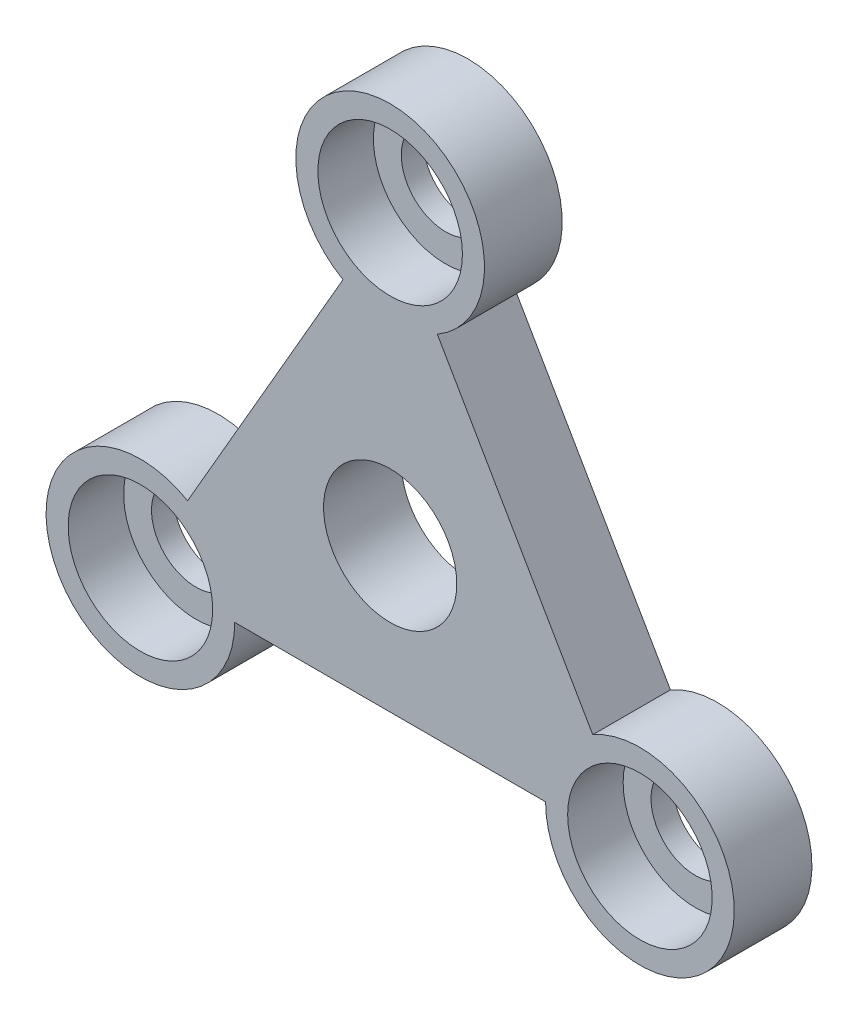
ISO-10303-21;
HEADER;
FILE_DESCRIPTION(('STEP AP214'),'2;1');
FILE_NAME('part.step','',(''),(''),'','','');
FILE_SCHEMA(('AUTOMOTIVE_DESIGN { 1 0 10303 214 1 1 1 1 }'));
ENDSEC;
DATA;
#1=APPLICATION_CONTEXT('core data for automotive mechanical design processes');
#2=APPLICATION_PROTOCOL_DEFINITION('international standard','automotive_design',2000,#1);
#3=PRODUCT_CONTEXT('',#1,'mechanical');
#4=PRODUCT('Part','Part','',(#3));
#5=PRODUCT_RELATED_PRODUCT_CATEGORY('part','',(#4));
#6=PRODUCT_DEFINITION_FORMATION('','',#4);
#7=PRODUCT_DEFINITION_CONTEXT('part definition',#1,'design');
#8=PRODUCT_DEFINITION('design','',#6,#7);
#9=PRODUCT_DEFINITION_SHAPE('','',#8);
#10=(LENGTH_UNIT() NAMED_UNIT(*) SI_UNIT(.MILLI.,.METRE.));
#11=(NAMED_UNIT(*) PLANE_ANGLE_UNIT() SI_UNIT($,.RADIAN.));
#12=(NAMED_UNIT(*) SI_UNIT($,.STERADIAN.) SOLID_ANGLE_UNIT());
#13=UNCERTAINTY_MEASURE_WITH_UNIT(LENGTH_MEASURE(1.E-05),#10,'distance_accuracy_value','');
#14=(GEOMETRIC_REPRESENTATION_CONTEXT(3) GLOBAL_UNCERTAINTY_ASSIGNED_CONTEXT((#13)) GLOBAL_UNIT_ASSIGNED_CONTEXT((#10,
#11,#12)) REPRESENTATION_CONTEXT('',''));
#15=CARTESIAN_POINT('',(0.,0.,0.));
#16=DIRECTION('',(0.,0.,1.));
#17=DIRECTION('',(1.,0.,0.));
#18=AXIS2_PLACEMENT_3D('',#15,#16,#17);
#19=CARTESIAN_POINT('',(22.5000000000002,38.9711431702996,7.));
#20=DIRECTION('',(0.866025403784436,-0.500000000000004,0.));
#21=DIRECTION('',(0.500000000000004,0.866025403784436,0.));
#22=AXIS2_PLACEMENT_3D('',#19,#20,#21);
#23=PLANE('',#22);
#24=DIRECTION('',(-0.500000000000004,-0.866025403784436,0.));
#25=VECTOR('',#24,1.);
#26=CARTESIAN_POINT('',(22.5000000000002,38.9711431702996,7.));
#27=LINE('',#26,#25);
#28=CARTESIAN_POINT('',(18.2500000000002,31.6099272381319,7.));
#29=VERTEX_POINT('',#28);
#30=CARTESIAN_POINT('',(4.25000000000003,7.36121593216771,7.));
#31=VERTEX_POINT('',#30);
#32=EDGE_CURVE('E104',#29,#31,#27,.T.);
#33=ORIENTED_EDGE('',*,*,#32,.F.);
#34=DIRECTION('',(0.,0.,1.));
#35=VECTOR('',#34,1.);
#36=CARTESIAN_POINT('',(18.2500000000002,31.6099272381319,0.));
#37=LINE('',#36,#35);
#38=CARTESIAN_POINT('',(18.2500000000002,31.6099272381319,0.));
#39=VERTEX_POINT('',#38);
#40=EDGE_CURVE('E89',#29,#39,#37,.F.);
#41=ORIENTED_EDGE('',*,*,#40,.T.);
#42=DIRECTION('',(-0.500000000000004,-0.866025403784436,0.));
#43=VECTOR('',#42,1.);
#44=CARTESIAN_POINT('',(22.5000000000002,38.9711431702996,0.));
#45=LINE('',#44,#43);
#46=CARTESIAN_POINT('',(4.25000000000003,7.36121593216771,0.));
#47=VERTEX_POINT('',#46);
#48=EDGE_CURVE('E102',#39,#47,#45,.T.);
#49=ORIENTED_EDGE('',*,*,#48,.T.);
#50=DIRECTION('',(0.,0.,1.));
#51=VECTOR('',#50,1.);
#52=CARTESIAN_POINT('',(4.25000000000003,7.36121593216771,0.));
#53=LINE('',#52,#51);
#54=EDGE_CURVE('E111',#47,#31,#53,.T.);
#55=ORIENTED_EDGE('',*,*,#54,.T.);
#56=EDGE_LOOP('',(#33,#41,#49,#55));
#57=FACE_BOUND('',#56,.T.);
#58=ADVANCED_FACE('F34',(#57),#23,.F.);
#59=CARTESIAN_POINT('',(0.,0.,7.));
#60=DIRECTION('',(0.,1.,0.));
#61=DIRECTION('',(-1.,0.,0.));
#62=AXIS2_PLACEMENT_3D('',#59,#60,#61);
#63=PLANE('',#62);
#64=DIRECTION('',(1.,0.,0.));
#65=VECTOR('',#64,1.);
#66=CARTESIAN_POINT('',(0.,0.,0.));
#67=LINE('',#66,#65);
#68=CARTESIAN_POINT('',(8.5,0.,0.));
#69=VERTEX_POINT('',#68);
#70=CARTESIAN_POINT('',(36.5000000000004,0.,0.));
#71=VERTEX_POINT('',#70);
#72=EDGE_CURVE('E110',#69,#71,#67,.T.);
#73=ORIENTED_EDGE('',*,*,#72,.T.);
#74=DIRECTION('',(0.,0.,1.));
#75=VECTOR('',#74,1.);
#76=CARTESIAN_POINT('',(36.5000000000004,0.,0.));
#77=LINE('',#76,#75);
#78=CARTESIAN_POINT('',(36.5000000000004,0.,7.));
#79=VERTEX_POINT('',#78);
#80=EDGE_CURVE('E122',#71,#79,#77,.T.);
#81=ORIENTED_EDGE('',*,*,#80,.T.);
#82=DIRECTION('',(1.,0.,0.));
#83=VECTOR('',#82,1.);
#84=CARTESIAN_POINT('',(0.,0.,7.));
#85=LINE('',#84,#83);
#86=CARTESIAN_POINT('',(8.5,0.,7.));
#87=VERTEX_POINT('',#86);
#88=EDGE_CURVE('E42',#87,#79,#85,.T.);
#89=ORIENTED_EDGE('',*,*,#88,.F.);
#90=DIRECTION('',(0.,0.,1.));
#91=VECTOR('',#90,1.);
#92=CARTESIAN_POINT('',(8.5,0.,0.));
#93=LINE('',#92,#91);
#94=EDGE_CURVE('E114',#87,#69,#93,.F.);
#95=ORIENTED_EDGE('',*,*,#94,.T.);
#96=EDGE_LOOP('',(#73,#81,#89,#95));
#97=FACE_BOUND('',#96,.T.);
#98=ADVANCED_FACE('F201',(#97),#63,.F.);
#99=CARTESIAN_POINT('',(45.0000000000004,0.,7.));
#100=DIRECTION('',(-0.866025403784436,-0.500000000000004,0.));
#101=DIRECTION('',(0.500000000000004,-0.866025403784436,0.));
#102=AXIS2_PLACEMENT_3D('',#99,#100,#101);
#103=PLANE('',#102);
#104=DIRECTION('',(-0.500000000000004,0.866025403784436,0.));
#105=VECTOR('',#104,1.);
#106=CARTESIAN_POINT('',(45.0000000000004,0.,0.));
#107=LINE('',#106,#105);
#108=CARTESIAN_POINT('',(40.7500000000003,7.36121593216771,0.));
#109=VERTEX_POINT('',#108);
#110=CARTESIAN_POINT('',(26.7500000000002,31.6099272381319,0.));
#111=VERTEX_POINT('',#110);
#112=EDGE_CURVE('E37',#109,#111,#107,.T.);
#113=ORIENTED_EDGE('',*,*,#112,.T.);
#114=DIRECTION('',(0.,0.,1.));
#115=VECTOR('',#114,1.);
#116=CARTESIAN_POINT('',(26.7500000000002,31.6099272381319,0.));
#117=LINE('',#116,#115);
#118=CARTESIAN_POINT('',(26.7500000000002,31.6099272381319,7.));
#119=VERTEX_POINT('',#118);
#120=EDGE_CURVE('E92',#111,#119,#117,.T.);
#121=ORIENTED_EDGE('',*,*,#120,.T.);
#122=DIRECTION('',(-0.500000000000004,0.866025403784436,0.));
#123=VECTOR('',#122,1.);
#124=CARTESIAN_POINT('',(45.0000000000004,0.,7.));
#125=LINE('',#124,#123);
#126=CARTESIAN_POINT('',(40.7500000000003,7.36121593216771,7.));
#127=VERTEX_POINT('',#126);
#128=EDGE_CURVE('E11',#127,#119,#125,.T.);
#129=ORIENTED_EDGE('',*,*,#128,.F.);
#130=DIRECTION('',(0.,0.,1.));
#131=VECTOR('',#130,1.);
#132=CARTESIAN_POINT('',(40.7500000000003,7.36121593216771,0.));
#133=LINE('',#132,#131);
#134=EDGE_CURVE('E126',#127,#109,#133,.F.);
#135=ORIENTED_EDGE('',*,*,#134,.T.);
#136=EDGE_LOOP('',(#113,#121,#129,#135));
#137=FACE_BOUND('',#136,.T.);
#138=ADVANCED_FACE('F189',(#137),#103,.F.);
#139=CARTESIAN_POINT('',(0.,0.,7.));
#140=DIRECTION('',(0.,0.,1.));
#141=DIRECTION('',(1.,0.,0.));
#142=AXIS2_PLACEMENT_3D('',#139,#140,#141);
#143=PLANE('',#142);
#144=CARTESIAN_POINT('',(22.5000000000002,12.9903810567664,7.));
#145=DIRECTION('',(0.,0.,1.));
#146=DIRECTION('',(1.,0.,0.));
#147=AXIS2_PLACEMENT_3D('',#144,#145,#146);
#148=CIRCLE('',#147,6.);
#149=CARTESIAN_POINT('',(28.5000000000002,12.9903810567664,7.));
#150=VERTEX_POINT('',#149);
#151=EDGE_CURVE('E171',#150,#150,#148,.T.);
#152=ORIENTED_EDGE('',*,*,#151,.F.);
#153=EDGE_LOOP('',(#152));
#154=FACE_BOUND('',#153,.T.);
#155=CARTESIAN_POINT('',(45.0000000000004,0.,7.));
#156=DIRECTION('',(0.,0.,1.));
#157=DIRECTION('',(-1.,0.,0.));
#158=AXIS2_PLACEMENT_3D('',#155,#156,#157);
#159=CIRCLE('',#158,6.50999999999999);
#160=CARTESIAN_POINT('',(38.4900000000004,0.,7.));
#161=VERTEX_POINT('',#160);
#162=EDGE_CURVE('E148',#161,#161,#159,.T.);
#163=ORIENTED_EDGE('',*,*,#162,.F.);
#164=EDGE_LOOP('',(#163));
#165=FACE_BOUND('',#164,.T.);
#166=CARTESIAN_POINT('',(22.5000000000002,38.9711431702996,7.));
#167=DIRECTION('',(0.,0.,1.));
#168=DIRECTION('',(1.,0.,0.));
#169=AXIS2_PLACEMENT_3D('',#166,#167,#168);
#170=CIRCLE('',#169,6.51);
#171=CARTESIAN_POINT('',(29.0100000000002,38.9711431702996,7.));
#172=VERTEX_POINT('',#171);
#173=EDGE_CURVE('E141',#172,#172,#170,.T.);
#174=ORIENTED_EDGE('',*,*,#173,.F.);
#175=EDGE_LOOP('',(#174));
#176=FACE_BOUND('',#175,.T.);
#177=CARTESIAN_POINT('',(0.,0.,7.));
#178=DIRECTION('',(0.,0.,1.));
#179=DIRECTION('',(1.,0.,0.));
#180=AXIS2_PLACEMENT_3D('',#177,#178,#179);
#181=CIRCLE('',#180,6.51);
#182=CARTESIAN_POINT('',(6.51,0.,7.));
#183=VERTEX_POINT('',#182);
#184=EDGE_CURVE('E135',#183,#183,#181,.T.);
#185=ORIENTED_EDGE('',*,*,#184,.F.);
#186=EDGE_LOOP('',(#185));
#187=FACE_BOUND('',#186,.T.);
#188=CARTESIAN_POINT('',(22.5000000000002,38.9711431702996,7.));
#189=DIRECTION('',(0.,0.,1.));
#190=DIRECTION('',(1.,0.,0.));
#191=AXIS2_PLACEMENT_3D('',#188,#189,#190);
#192=CIRCLE('',#191,8.49999999999999);
#193=EDGE_CURVE('E97',#119,#29,#192,.T.);
#194=ORIENTED_EDGE('',*,*,#193,.T.);
#195=ORIENTED_EDGE('',*,*,#32,.T.);
#196=CARTESIAN_POINT('',(0.,0.,7.));
#197=DIRECTION('',(0.,0.,1.));
#198=DIRECTION('',(1.,0.,0.));
#199=AXIS2_PLACEMENT_3D('',#196,#197,#198);
#200=CIRCLE('',#199,8.5);
#201=EDGE_CURVE('E55',#31,#87,#200,.T.);
#202=ORIENTED_EDGE('',*,*,#201,.T.);
#203=ORIENTED_EDGE('',*,*,#88,.T.);
#204=CARTESIAN_POINT('',(45.0000000000004,0.,7.));
#205=DIRECTION('',(0.,0.,1.));
#206=DIRECTION('',(-1.,0.,0.));
#207=AXIS2_PLACEMENT_3D('',#204,#205,#206);
#208=CIRCLE('',#207,8.5);
#209=EDGE_CURVE('E49',#79,#127,#208,.T.);
#210=ORIENTED_EDGE('',*,*,#209,.T.);
#211=ORIENTED_EDGE('',*,*,#128,.T.);
#212=EDGE_LOOP('',(#194,#195,#202,#203,#210,#211));
#213=FACE_BOUND('',#212,.T.);
#214=ADVANCED_FACE('F186',(#154,#165,#176,#187,#213),#143,.T.);
#215=CARTESIAN_POINT('',(0.,0.,0.));
#216=DIRECTION('',(0.,0.,1.));
#217=DIRECTION('',(1.,0.,0.));
#218=AXIS2_PLACEMENT_3D('',#215,#216,#217);
#219=PLANE('',#218);
#220=CARTESIAN_POINT('',(22.5000000000002,12.9903810567664,0.));
#221=DIRECTION('',(0.,0.,1.));
#222=DIRECTION('',(1.,0.,0.));
#223=AXIS2_PLACEMENT_3D('',#220,#221,#222);
#224=CIRCLE('',#223,6.);
#225=CARTESIAN_POINT('',(28.5000000000002,12.9903810567664,0.));
#226=VERTEX_POINT('',#225);
#227=EDGE_CURVE('E163',#226,#226,#224,.T.);
#228=ORIENTED_EDGE('',*,*,#227,.T.);
#229=EDGE_LOOP('',(#228));
#230=FACE_BOUND('',#229,.T.);
#231=CARTESIAN_POINT('',(45.0000000000004,0.,0.));
#232=DIRECTION('',(0.,0.,1.));
#233=DIRECTION('',(-1.,0.,0.));
#234=AXIS2_PLACEMENT_3D('',#231,#232,#233);
#235=CIRCLE('',#234,4.);
#236=CARTESIAN_POINT('',(41.0000000000004,0.,0.));
#237=VERTEX_POINT('',#236);
#238=EDGE_CURVE('E156',#237,#237,#235,.T.);
#239=ORIENTED_EDGE('',*,*,#238,.T.);
#240=EDGE_LOOP('',(#239));
#241=FACE_BOUND('',#240,.T.);
#242=CARTESIAN_POINT('',(22.5000000000002,38.9711431702996,0.));
#243=DIRECTION('',(0.,0.,1.));
#244=DIRECTION('',(1.,0.,0.));
#245=AXIS2_PLACEMENT_3D('',#242,#243,#244);
#246=CIRCLE('',#245,3.99999999999999);
#247=CARTESIAN_POINT('',(26.5000000000002,38.9711431702996,0.));
#248=VERTEX_POINT('',#247);
#249=EDGE_CURVE('E162',#248,#248,#246,.T.);
#250=ORIENTED_EDGE('',*,*,#249,.T.);
#251=EDGE_LOOP('',(#250));
#252=FACE_BOUND('',#251,.T.);
#253=CARTESIAN_POINT('',(0.,0.,0.));
#254=DIRECTION('',(0.,0.,1.));
#255=DIRECTION('',(1.,0.,0.));
#256=AXIS2_PLACEMENT_3D('',#253,#254,#255);
#257=CIRCLE('',#256,4.);
#258=CARTESIAN_POINT('',(4.,0.,0.));
#259=VERTEX_POINT('',#258);
#260=EDGE_CURVE('E145',#259,#259,#257,.T.);
#261=ORIENTED_EDGE('',*,*,#260,.T.);
#262=EDGE_LOOP('',(#261));
#263=FACE_BOUND('',#262,.T.);
#264=ORIENTED_EDGE('',*,*,#48,.F.);
#265=CARTESIAN_POINT('',(22.5000000000002,38.9711431702996,0.));
#266=DIRECTION('',(0.,0.,1.));
#267=DIRECTION('',(1.,0.,0.));
#268=AXIS2_PLACEMENT_3D('',#265,#266,#267);
#269=CIRCLE('',#268,8.49999999999999);
#270=EDGE_CURVE('E86',#111,#39,#269,.T.);
#271=ORIENTED_EDGE('',*,*,#270,.F.);
#272=ORIENTED_EDGE('',*,*,#112,.F.);
#273=CARTESIAN_POINT('',(45.0000000000004,0.,0.));
#274=DIRECTION('',(0.,0.,1.));
#275=DIRECTION('',(-1.,0.,0.));
#276=AXIS2_PLACEMENT_3D('',#273,#274,#275);
#277=CIRCLE('',#276,8.5);
#278=EDGE_CURVE('E129',#71,#109,#277,.T.);
#279=ORIENTED_EDGE('',*,*,#278,.F.);
#280=ORIENTED_EDGE('',*,*,#72,.F.);
#281=CARTESIAN_POINT('',(0.,0.,0.));
#282=DIRECTION('',(0.,0.,1.));
#283=DIRECTION('',(1.,0.,0.));
#284=AXIS2_PLACEMENT_3D('',#281,#282,#283);
#285=CIRCLE('',#284,8.5);
#286=EDGE_CURVE('E109',#47,#69,#285,.T.);
#287=ORIENTED_EDGE('',*,*,#286,.F.);
#288=EDGE_LOOP('',(#264,#271,#272,#279,#280,#287));
#289=FACE_BOUND('',#288,.T.);
#290=ADVANCED_FACE('F107',(#230,#241,#252,#263,#289),#219,.F.);
#291=CARTESIAN_POINT('',(0.,0.,0.));
#292=DIRECTION('',(0.,0.,1.));
#293=DIRECTION('',(1.,0.,0.));
#294=AXIS2_PLACEMENT_3D('',#291,#292,#293);
#295=CYLINDRICAL_SURFACE('',#294,8.5);
#296=ORIENTED_EDGE('',*,*,#54,.F.);
#297=ORIENTED_EDGE('',*,*,#286,.T.);
#298=ORIENTED_EDGE('',*,*,#94,.F.);
#299=ORIENTED_EDGE('',*,*,#201,.F.);
#300=EDGE_LOOP('',(#296,#297,#298,#299));
#301=FACE_BOUND('',#300,.T.);
#302=ADVANCED_FACE('F204',(#301),#295,.T.);
#303=CARTESIAN_POINT('',(45.0000000000004,0.,0.));
#304=DIRECTION('',(0.,0.,1.));
#305=DIRECTION('',(1.,0.,0.));
#306=AXIS2_PLACEMENT_3D('',#303,#304,#305);
#307=CYLINDRICAL_SURFACE('',#306,8.5);
#308=ORIENTED_EDGE('',*,*,#80,.F.);
#309=ORIENTED_EDGE('',*,*,#278,.T.);
#310=ORIENTED_EDGE('',*,*,#134,.F.);
#311=ORIENTED_EDGE('',*,*,#209,.F.);
#312=EDGE_LOOP('',(#308,#309,#310,#311));
#313=FACE_BOUND('',#312,.T.);
#314=ADVANCED_FACE('F206',(#313),#307,.T.);
#315=CARTESIAN_POINT('',(22.5000000000002,38.9711431702996,0.));
#316=DIRECTION('',(0.,0.,1.));
#317=DIRECTION('',(1.,0.,0.));
#318=AXIS2_PLACEMENT_3D('',#315,#316,#317);
#319=CYLINDRICAL_SURFACE('',#318,8.49999999999999);
#320=ORIENTED_EDGE('',*,*,#40,.F.);
#321=ORIENTED_EDGE('',*,*,#193,.F.);
#322=ORIENTED_EDGE('',*,*,#120,.F.);
#323=ORIENTED_EDGE('',*,*,#270,.T.);
#324=EDGE_LOOP('',(#320,#321,#322,#323));
#325=FACE_BOUND('',#324,.T.);
#326=ADVANCED_FACE('F88',(#325),#319,.T.);
#327=CARTESIAN_POINT('',(0.,0.,2.));
#328=DIRECTION('',(0.,0.,1.));
#329=DIRECTION('',(1.,0.,0.));
#330=AXIS2_PLACEMENT_3D('',#327,#328,#329);
#331=CYLINDRICAL_SURFACE('',#330,6.51);
#332=CARTESIAN_POINT('',(0.,0.,2.));
#333=DIRECTION('',(0.,0.,1.));
#334=DIRECTION('',(1.,0.,0.));
#335=AXIS2_PLACEMENT_3D('',#332,#333,#334);
#336=CIRCLE('',#335,6.51);
#337=CARTESIAN_POINT('',(6.51,0.,2.));
#338=VERTEX_POINT('',#337);
#339=EDGE_CURVE('E133',#338,#338,#336,.T.);
#340=ORIENTED_EDGE('',*,*,#339,.F.);
#341=EDGE_LOOP('',(#340));
#342=FACE_BOUND('',#341,.T.);
#343=ORIENTED_EDGE('',*,*,#184,.T.);
#344=EDGE_LOOP('',(#343));
#345=FACE_BOUND('',#344,.T.);
#346=ADVANCED_FACE('F305',(#342,#345),#331,.F.);
#347=CARTESIAN_POINT('',(0.,0.,2.));
#348=DIRECTION('',(0.,0.,1.));
#349=DIRECTION('',(1.,0.,0.));
#350=AXIS2_PLACEMENT_3D('',#347,#348,#349);
#351=PLANE('',#350);
#352=CARTESIAN_POINT('',(0.,0.,2.));
#353=DIRECTION('',(0.,0.,1.));
#354=DIRECTION('',(1.,0.,0.));
#355=AXIS2_PLACEMENT_3D('',#352,#353,#354);
#356=CIRCLE('',#355,4.);
#357=CARTESIAN_POINT('',(4.,0.,2.));
#358=VERTEX_POINT('',#357);
#359=EDGE_CURVE('E153',#358,#358,#356,.T.);
#360=ORIENTED_EDGE('',*,*,#359,.F.);
#361=EDGE_LOOP('',(#360));
#362=FACE_BOUND('',#361,.T.);
#363=ORIENTED_EDGE('',*,*,#339,.T.);
#364=EDGE_LOOP('',(#363));
#365=FACE_BOUND('',#364,.T.);
#366=ADVANCED_FACE('F297',(#362,#365),#351,.T.);
#367=CARTESIAN_POINT('',(22.5000000000002,38.9711431702996,2.));
#368=DIRECTION('',(0.,0.,1.));
#369=DIRECTION('',(1.,0.,0.));
#370=AXIS2_PLACEMENT_3D('',#367,#368,#369);
#371=CYLINDRICAL_SURFACE('',#370,6.51);
#372=CARTESIAN_POINT('',(22.5000000000002,38.9711431702996,2.));
#373=DIRECTION('',(0.,0.,1.));
#374=DIRECTION('',(1.,0.,0.));
#375=AXIS2_PLACEMENT_3D('',#372,#373,#374);
#376=CIRCLE('',#375,6.51);
#377=CARTESIAN_POINT('',(29.0100000000002,38.9711431702996,2.));
#378=VERTEX_POINT('',#377);
#379=EDGE_CURVE('E144',#378,#378,#376,.T.);
#380=ORIENTED_EDGE('',*,*,#379,.F.);
#381=EDGE_LOOP('',(#380));
#382=FACE_BOUND('',#381,.T.);
#383=ORIENTED_EDGE('',*,*,#173,.T.);
#384=EDGE_LOOP('',(#383));
#385=FACE_BOUND('',#384,.T.);
#386=ADVANCED_FACE('F290',(#382,#385),#371,.F.);
#387=CARTESIAN_POINT('',(22.5000000000002,38.9711431702996,2.));
#388=DIRECTION('',(0.,0.,1.));
#389=DIRECTION('',(1.,0.,0.));
#390=AXIS2_PLACEMENT_3D('',#387,#388,#389);
#391=PLANE('',#390);
#392=CARTESIAN_POINT('',(22.5000000000002,38.9711431702996,2.));
#393=DIRECTION('',(0.,0.,1.));
#394=DIRECTION('',(1.,0.,0.));
#395=AXIS2_PLACEMENT_3D('',#392,#393,#394);
#396=CIRCLE('',#395,3.99999999999999);
#397=CARTESIAN_POINT('',(26.5000000000002,38.9711431702996,2.));
#398=VERTEX_POINT('',#397);
#399=EDGE_CURVE('E159',#398,#398,#396,.T.);
#400=ORIENTED_EDGE('',*,*,#399,.F.);
#401=EDGE_LOOP('',(#400));
#402=FACE_BOUND('',#401,.T.);
#403=ORIENTED_EDGE('',*,*,#379,.T.);
#404=EDGE_LOOP('',(#403));
#405=FACE_BOUND('',#404,.T.);
#406=ADVANCED_FACE('F281',(#402,#405),#391,.T.);
#407=CARTESIAN_POINT('',(45.0000000000004,0.,2.));
#408=DIRECTION('',(0.,0.,1.));
#409=DIRECTION('',(1.,0.,0.));
#410=AXIS2_PLACEMENT_3D('',#407,#408,#409);
#411=CYLINDRICAL_SURFACE('',#410,6.50999999999999);
#412=CARTESIAN_POINT('',(45.0000000000004,0.,2.));
#413=DIRECTION('',(0.,0.,1.));
#414=DIRECTION('',(-1.,0.,0.));
#415=AXIS2_PLACEMENT_3D('',#412,#413,#414);
#416=CIRCLE('',#415,6.50999999999999);
#417=CARTESIAN_POINT('',(38.4900000000004,0.,2.));
#418=VERTEX_POINT('',#417);
#419=EDGE_CURVE('E138',#418,#418,#416,.T.);
#420=ORIENTED_EDGE('',*,*,#419,.F.);
#421=EDGE_LOOP('',(#420));
#422=FACE_BOUND('',#421,.T.);
#423=ORIENTED_EDGE('',*,*,#162,.T.);
#424=EDGE_LOOP('',(#423));
#425=FACE_BOUND('',#424,.T.);
#426=ADVANCED_FACE('F272',(#422,#425),#411,.F.);
#427=CARTESIAN_POINT('',(45.0000000000004,0.,2.));
#428=DIRECTION('',(0.,0.,-1.));
#429=DIRECTION('',(-1.,0.,0.));
#430=AXIS2_PLACEMENT_3D('',#427,#428,#429);
#431=PLANE('',#430);
#432=CARTESIAN_POINT('',(45.0000000000004,0.,2.));
#433=DIRECTION('',(0.,0.,1.));
#434=DIRECTION('',(-1.,0.,0.));
#435=AXIS2_PLACEMENT_3D('',#432,#433,#434);
#436=CIRCLE('',#435,4.);
#437=CARTESIAN_POINT('',(41.0000000000004,0.,2.));
#438=VERTEX_POINT('',#437);
#439=EDGE_CURVE('E166',#438,#438,#436,.T.);
#440=ORIENTED_EDGE('',*,*,#439,.F.);
#441=EDGE_LOOP('',(#440));
#442=FACE_BOUND('',#441,.T.);
#443=ORIENTED_EDGE('',*,*,#419,.T.);
#444=EDGE_LOOP('',(#443));
#445=FACE_BOUND('',#444,.T.);
#446=ADVANCED_FACE('F264',(#442,#445),#431,.F.);
#447=CARTESIAN_POINT('',(0.,0.,0.));
#448=DIRECTION('',(0.,0.,1.));
#449=DIRECTION('',(1.,0.,0.));
#450=AXIS2_PLACEMENT_3D('',#447,#448,#449);
#451=CYLINDRICAL_SURFACE('',#450,4.);
#452=ORIENTED_EDGE('',*,*,#260,.F.);
#453=EDGE_LOOP('',(#452));
#454=FACE_BOUND('',#453,.T.);
#455=ORIENTED_EDGE('',*,*,#359,.T.);
#456=EDGE_LOOP('',(#455));
#457=FACE_BOUND('',#456,.T.);
#458=ADVANCED_FACE('F256',(#454,#457),#451,.F.);
#459=CARTESIAN_POINT('',(45.0000000000004,0.,0.));
#460=DIRECTION('',(0.,0.,1.));
#461=DIRECTION('',(1.,0.,0.));
#462=AXIS2_PLACEMENT_3D('',#459,#460,#461);
#463=CYLINDRICAL_SURFACE('',#462,4.);
#464=ORIENTED_EDGE('',*,*,#238,.F.);
#465=EDGE_LOOP('',(#464));
#466=FACE_BOUND('',#465,.T.);
#467=ORIENTED_EDGE('',*,*,#439,.T.);
#468=EDGE_LOOP('',(#467));
#469=FACE_BOUND('',#468,.T.);
#470=ADVANCED_FACE('F249',(#466,#469),#463,.F.);
#471=CARTESIAN_POINT('',(22.5000000000002,38.9711431702996,0.));
#472=DIRECTION('',(0.,0.,1.));
#473=DIRECTION('',(1.,0.,0.));
#474=AXIS2_PLACEMENT_3D('',#471,#472,#473);
#475=CYLINDRICAL_SURFACE('',#474,3.99999999999999);
#476=ORIENTED_EDGE('',*,*,#249,.F.);
#477=EDGE_LOOP('',(#476));
#478=FACE_BOUND('',#477,.T.);
#479=ORIENTED_EDGE('',*,*,#399,.T.);
#480=EDGE_LOOP('',(#479));
#481=FACE_BOUND('',#480,.T.);
#482=ADVANCED_FACE('F182',(#478,#481),#475,.F.);
#483=CARTESIAN_POINT('',(22.5000000000002,12.9903810567664,0.));
#484=DIRECTION('',(0.,0.,1.));
#485=DIRECTION('',(1.,0.,0.));
#486=AXIS2_PLACEMENT_3D('',#483,#484,#485);
#487=CYLINDRICAL_SURFACE('',#486,6.);
#488=ORIENTED_EDGE('',*,*,#227,.F.);
#489=EDGE_LOOP('',(#488));
#490=FACE_BOUND('',#489,.T.);
#491=ORIENTED_EDGE('',*,*,#151,.T.);
#492=EDGE_LOOP('',(#491));
#493=FACE_BOUND('',#492,.T.);
#494=ADVANCED_FACE('F179',(#490,#493),#487,.F.);
#495=CLOSED_SHELL('',(#58,#98,#138,#214,#290,#302,#314,#326,#346,#366,#386,#406,#426,#446,#458,
#470,#482,#494));
#496=MANIFOLD_SOLID_BREP('B2',#495);
#497=ADVANCED_BREP_SHAPE_REPRESENTATION('',(#18,#496),#14);
#498=SHAPE_DEFINITION_REPRESENTATION(#9,#497);
ENDSEC;
END-ISO-10303-21;
